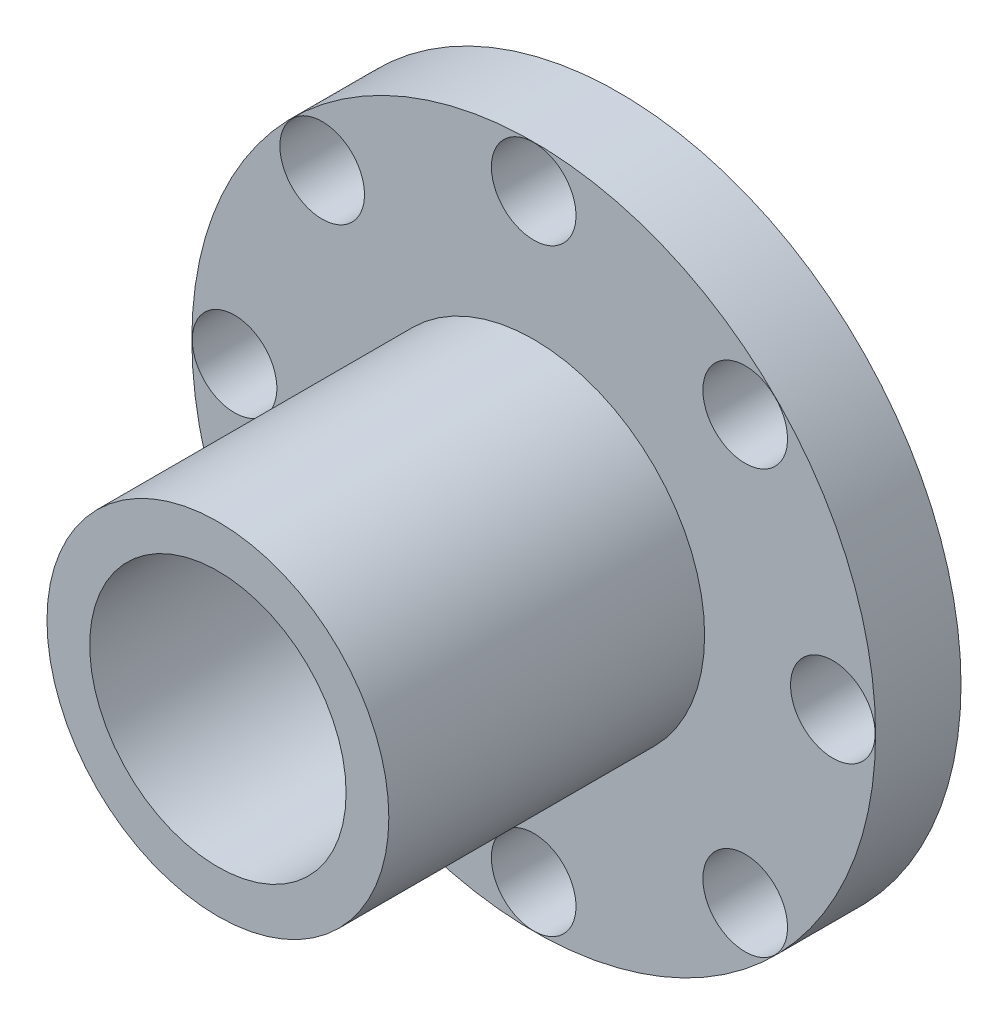
ISO-10303-21;
HEADER;
FILE_DESCRIPTION(('STEP AP214'),'2;1');
FILE_NAME('part.step','',(''),(''),'','','');
FILE_SCHEMA(('AUTOMOTIVE_DESIGN { 1 0 10303 214 1 1 1 1 }'));
ENDSEC;
DATA;
#1=APPLICATION_CONTEXT('core data for automotive mechanical design processes');
#2=APPLICATION_PROTOCOL_DEFINITION('international standard','automotive_design',2000,#1);
#3=PRODUCT_CONTEXT('',#1,'mechanical');
#4=PRODUCT('Part','Part','',(#3));
#5=PRODUCT_RELATED_PRODUCT_CATEGORY('part','',(#4));
#6=PRODUCT_DEFINITION_FORMATION('','',#4);
#7=PRODUCT_DEFINITION_CONTEXT('part definition',#1,'design');
#8=PRODUCT_DEFINITION('design','',#6,#7);
#9=PRODUCT_DEFINITION_SHAPE('','',#8);
#10=(LENGTH_UNIT() NAMED_UNIT(*) SI_UNIT(.MILLI.,.METRE.));
#11=(NAMED_UNIT(*) PLANE_ANGLE_UNIT() SI_UNIT($,.RADIAN.));
#12=(NAMED_UNIT(*) SI_UNIT($,.STERADIAN.) SOLID_ANGLE_UNIT());
#13=UNCERTAINTY_MEASURE_WITH_UNIT(LENGTH_MEASURE(1.E-05),#10,'distance_accuracy_value','');
#14=(GEOMETRIC_REPRESENTATION_CONTEXT(3) GLOBAL_UNCERTAINTY_ASSIGNED_CONTEXT((#13)) GLOBAL_UNIT_ASSIGNED_CONTEXT((#10,
#11,#12)) REPRESENTATION_CONTEXT('',''));
#15=CARTESIAN_POINT('',(0.,0.,0.));
#16=DIRECTION('',(0.,0.,1.));
#17=DIRECTION('',(1.,0.,0.));
#18=AXIS2_PLACEMENT_3D('',#15,#16,#17);
#19=CARTESIAN_POINT('',(0.,0.,9.39));
#20=DIRECTION('',(0.,0.,-1.));
#21=DIRECTION('',(-1.,0.,0.));
#22=AXIS2_PLACEMENT_3D('',#19,#20,#21);
#23=CYLINDRICAL_SURFACE('',#22,4.);
#24=CARTESIAN_POINT('',(0.,0.,9.39));
#25=DIRECTION('',(0.,0.,1.));
#26=DIRECTION('',(1.,0.,0.));
#27=AXIS2_PLACEMENT_3D('',#24,#25,#26);
#28=CIRCLE('',#27,4.);
#29=CARTESIAN_POINT('',(4.,0.,9.39));
#30=VERTEX_POINT('',#29);
#31=EDGE_CURVE('E43',#30,#30,#28,.T.);
#32=ORIENTED_EDGE('',*,*,#31,.F.);
#33=EDGE_LOOP('',(#32));
#34=FACE_BOUND('',#33,.T.);
#35=CARTESIAN_POINT('',(0.,0.,2.));
#36=DIRECTION('',(0.,0.,-1.));
#37=DIRECTION('',(-1.,0.,0.));
#38=AXIS2_PLACEMENT_3D('',#35,#36,#37);
#39=CIRCLE('',#38,4.);
#40=CARTESIAN_POINT('',(-4.,0.,2.));
#41=VERTEX_POINT('',#40);
#42=EDGE_CURVE('E11',#41,#41,#39,.T.);
#43=ORIENTED_EDGE('',*,*,#42,.F.);
#44=EDGE_LOOP('',(#43));
#45=FACE_BOUND('',#44,.T.);
#46=ADVANCED_FACE('F37',(#34,#45),#23,.T.);
#47=CARTESIAN_POINT('',(0.,0.,9.39));
#48=DIRECTION('',(0.,0.,1.));
#49=DIRECTION('',(1.,0.,0.));
#50=AXIS2_PLACEMENT_3D('',#47,#48,#49);
#51=PLANE('',#50);
#52=CARTESIAN_POINT('',(0.,0.,9.39));
#53=DIRECTION('',(0.,0.,1.));
#54=DIRECTION('',(1.,0.,0.));
#55=AXIS2_PLACEMENT_3D('',#52,#53,#54);
#56=CIRCLE('',#55,3.);
#57=CARTESIAN_POINT('',(3.,0.,9.39));
#58=VERTEX_POINT('',#57);
#59=EDGE_CURVE('E47',#58,#58,#56,.T.);
#60=ORIENTED_EDGE('',*,*,#59,.F.);
#61=EDGE_LOOP('',(#60));
#62=FACE_BOUND('',#61,.T.);
#63=ORIENTED_EDGE('',*,*,#31,.T.);
#64=EDGE_LOOP('',(#63));
#65=FACE_BOUND('',#64,.T.);
#66=ADVANCED_FACE('F125',(#62,#65),#51,.T.);
#67=CARTESIAN_POINT('',(0.,0.,0.));
#68=DIRECTION('',(0.,0.,1.));
#69=DIRECTION('',(1.,0.,0.));
#70=AXIS2_PLACEMENT_3D('',#67,#68,#69);
#71=PLANE('',#70);
#72=CARTESIAN_POINT('',(-7.,0.,0.));
#73=DIRECTION('',(0.,0.,-1.));
#74=DIRECTION('',(-1.,0.,0.));
#75=AXIS2_PLACEMENT_3D('',#72,#73,#74);
#76=CIRCLE('',#75,0.99);
#77=CARTESIAN_POINT('',(-7.99,0.,0.));
#78=VERTEX_POINT('',#77);
#79=EDGE_CURVE('E105',#78,#78,#76,.T.);
#80=ORIENTED_EDGE('',*,*,#79,.F.);
#81=EDGE_LOOP('',(#80));
#82=FACE_BOUND('',#81,.T.);
#83=CARTESIAN_POINT('',(-4.94974746830583,-4.94974746830584,0.));
#84=DIRECTION('',(0.,0.,-1.));
#85=DIRECTION('',(-1.,0.,0.));
#86=AXIS2_PLACEMENT_3D('',#83,#84,#85);
#87=CIRCLE('',#86,0.990000000000001);
#88=CARTESIAN_POINT('',(-5.93974746830583,-4.94974746830584,0.));
#89=VERTEX_POINT('',#88);
#90=EDGE_CURVE('E99',#89,#89,#87,.T.);
#91=ORIENTED_EDGE('',*,*,#90,.F.);
#92=EDGE_LOOP('',(#91));
#93=FACE_BOUND('',#92,.T.);
#94=CARTESIAN_POINT('',(0.,-7.,0.));
#95=DIRECTION('',(0.,0.,-1.));
#96=DIRECTION('',(-1.,0.,0.));
#97=AXIS2_PLACEMENT_3D('',#94,#95,#96);
#98=CIRCLE('',#97,0.990000000000001);
#99=CARTESIAN_POINT('',(-0.989999999999977,-7.,0.));
#100=VERTEX_POINT('',#99);
#101=EDGE_CURVE('E93',#100,#100,#98,.T.);
#102=ORIENTED_EDGE('',*,*,#101,.F.);
#103=EDGE_LOOP('',(#102));
#104=FACE_BOUND('',#103,.T.);
#105=CARTESIAN_POINT('',(4.94974746830586,-4.94974746830581,0.));
#106=DIRECTION('',(0.,0.,-1.));
#107=DIRECTION('',(-1.,0.,0.));
#108=AXIS2_PLACEMENT_3D('',#105,#106,#107);
#109=CIRCLE('',#108,0.990000000000001);
#110=CARTESIAN_POINT('',(3.95974746830586,-4.94974746830581,0.));
#111=VERTEX_POINT('',#110);
#112=EDGE_CURVE('E87',#111,#111,#109,.T.);
#113=ORIENTED_EDGE('',*,*,#112,.F.);
#114=EDGE_LOOP('',(#113));
#115=FACE_BOUND('',#114,.T.);
#116=CARTESIAN_POINT('',(7.,0.,0.));
#117=DIRECTION('',(0.,0.,-1.));
#118=DIRECTION('',(-1.,0.,0.));
#119=AXIS2_PLACEMENT_3D('',#116,#117,#118);
#120=CIRCLE('',#119,0.99);
#121=CARTESIAN_POINT('',(6.01,0.,0.));
#122=VERTEX_POINT('',#121);
#123=EDGE_CURVE('E81',#122,#122,#120,.T.);
#124=ORIENTED_EDGE('',*,*,#123,.F.);
#125=EDGE_LOOP('',(#124));
#126=FACE_BOUND('',#125,.T.);
#127=CARTESIAN_POINT('',(4.94974746830579,4.94974746830588,0.));
#128=DIRECTION('',(0.,0.,-1.));
#129=DIRECTION('',(-1.,0.,0.));
#130=AXIS2_PLACEMENT_3D('',#127,#128,#129);
#131=CIRCLE('',#130,0.99);
#132=CARTESIAN_POINT('',(3.95974746830579,4.94974746830588,0.));
#133=VERTEX_POINT('',#132);
#134=EDGE_CURVE('E75',#133,#133,#131,.T.);
#135=ORIENTED_EDGE('',*,*,#134,.F.);
#136=EDGE_LOOP('',(#135));
#137=FACE_BOUND('',#136,.T.);
#138=CARTESIAN_POINT('',(0.,7.,0.));
#139=DIRECTION('',(0.,0.,-1.));
#140=DIRECTION('',(-1.,0.,0.));
#141=AXIS2_PLACEMENT_3D('',#138,#139,#140);
#142=CIRCLE('',#141,0.99);
#143=CARTESIAN_POINT('',(-0.990000000000073,7.,0.));
#144=VERTEX_POINT('',#143);
#145=EDGE_CURVE('E69',#144,#144,#142,.T.);
#146=ORIENTED_EDGE('',*,*,#145,.F.);
#147=EDGE_LOOP('',(#146));
#148=FACE_BOUND('',#147,.T.);
#149=CARTESIAN_POINT('',(-4.94974746830589,4.94974746830577,0.));
#150=DIRECTION('',(0.,0.,-1.));
#151=DIRECTION('',(-1.,0.,0.));
#152=AXIS2_PLACEMENT_3D('',#149,#150,#151);
#153=CIRCLE('',#152,0.99);
#154=CARTESIAN_POINT('',(-5.93974746830589,4.94974746830577,0.));
#155=VERTEX_POINT('',#154);
#156=EDGE_CURVE('E63',#155,#155,#153,.T.);
#157=ORIENTED_EDGE('',*,*,#156,.F.);
#158=EDGE_LOOP('',(#157));
#159=FACE_BOUND('',#158,.T.);
#160=CARTESIAN_POINT('',(0.,0.,0.));
#161=DIRECTION('',(0.,0.,-1.));
#162=DIRECTION('',(-1.,0.,0.));
#163=AXIS2_PLACEMENT_3D('',#160,#161,#162);
#164=CIRCLE('',#163,3.);
#165=CARTESIAN_POINT('',(-3.,0.,0.));
#166=VERTEX_POINT('',#165);
#167=EDGE_CURVE('E51',#166,#166,#164,.T.);
#168=ORIENTED_EDGE('',*,*,#167,.F.);
#169=EDGE_LOOP('',(#168));
#170=FACE_BOUND('',#169,.T.);
#171=CARTESIAN_POINT('',(0.,0.,0.));
#172=DIRECTION('',(0.,0.,-1.));
#173=DIRECTION('',(-1.,0.,0.));
#174=AXIS2_PLACEMENT_3D('',#171,#172,#173);
#175=CIRCLE('',#174,8.);
#176=CARTESIAN_POINT('',(-8.,0.,0.));
#177=VERTEX_POINT('',#176);
#178=EDGE_CURVE('E57',#177,#177,#175,.T.);
#179=ORIENTED_EDGE('',*,*,#178,.T.);
#180=EDGE_LOOP('',(#179));
#181=FACE_BOUND('',#180,.T.);
#182=ADVANCED_FACE('F121',(#82,#93,#104,#115,#126,#137,#148,#159,#170,#181),#71,.F.);
#183=CARTESIAN_POINT('',(0.,0.,1.39));
#184=DIRECTION('',(0.,0.,1.));
#185=DIRECTION('',(1.,0.,0.));
#186=AXIS2_PLACEMENT_3D('',#183,#184,#185);
#187=CYLINDRICAL_SURFACE('',#186,3.);
#188=ORIENTED_EDGE('',*,*,#167,.T.);
#189=EDGE_LOOP('',(#188));
#190=FACE_BOUND('',#189,.T.);
#191=ORIENTED_EDGE('',*,*,#59,.T.);
#192=EDGE_LOOP('',(#191));
#193=FACE_BOUND('',#192,.T.);
#194=ADVANCED_FACE('F124',(#190,#193),#187,.F.);
#195=CARTESIAN_POINT('',(0.,0.,2.));
#196=DIRECTION('',(0.,0.,-1.));
#197=DIRECTION('',(-1.,0.,0.));
#198=AXIS2_PLACEMENT_3D('',#195,#196,#197);
#199=CYLINDRICAL_SURFACE('',#198,8.);
#200=CARTESIAN_POINT('',(0.,0.,2.));
#201=DIRECTION('',(0.,0.,-1.));
#202=DIRECTION('',(-1.,0.,0.));
#203=AXIS2_PLACEMENT_3D('',#200,#201,#202);
#204=CIRCLE('',#203,8.);
#205=CARTESIAN_POINT('',(-8.,0.,2.));
#206=VERTEX_POINT('',#205);
#207=EDGE_CURVE('E56',#206,#206,#204,.T.);
#208=ORIENTED_EDGE('',*,*,#207,.T.);
#209=EDGE_LOOP('',(#208));
#210=FACE_BOUND('',#209,.T.);
#211=ORIENTED_EDGE('',*,*,#178,.F.);
#212=EDGE_LOOP('',(#211));
#213=FACE_BOUND('',#212,.T.);
#214=ADVANCED_FACE('F144',(#210,#213),#199,.T.);
#215=CARTESIAN_POINT('',(0.,0.,2.));
#216=DIRECTION('',(0.,0.,-1.));
#217=DIRECTION('',(-1.,0.,0.));
#218=AXIS2_PLACEMENT_3D('',#215,#216,#217);
#219=PLANE('',#218);
#220=CARTESIAN_POINT('',(-7.,0.,2.));
#221=DIRECTION('',(0.,0.,-1.));
#222=DIRECTION('',(-1.,0.,0.));
#223=AXIS2_PLACEMENT_3D('',#220,#221,#222);
#224=CIRCLE('',#223,0.99);
#225=CARTESIAN_POINT('',(-7.99,0.,2.));
#226=VERTEX_POINT('',#225);
#227=EDGE_CURVE('E60',#226,#226,#224,.T.);
#228=ORIENTED_EDGE('',*,*,#227,.T.);
#229=EDGE_LOOP('',(#228));
#230=FACE_BOUND('',#229,.T.);
#231=CARTESIAN_POINT('',(-4.94974746830583,-4.94974746830584,2.));
#232=DIRECTION('',(0.,0.,-1.));
#233=DIRECTION('',(-1.,0.,0.));
#234=AXIS2_PLACEMENT_3D('',#231,#232,#233);
#235=CIRCLE('',#234,0.990000000000001);
#236=CARTESIAN_POINT('',(-5.93974746830583,-4.94974746830584,2.));
#237=VERTEX_POINT('',#236);
#238=EDGE_CURVE('E102',#237,#237,#235,.T.);
#239=ORIENTED_EDGE('',*,*,#238,.T.);
#240=EDGE_LOOP('',(#239));
#241=FACE_BOUND('',#240,.T.);
#242=CARTESIAN_POINT('',(0.,-7.,2.));
#243=DIRECTION('',(0.,0.,-1.));
#244=DIRECTION('',(-1.,0.,0.));
#245=AXIS2_PLACEMENT_3D('',#242,#243,#244);
#246=CIRCLE('',#245,0.990000000000001);
#247=CARTESIAN_POINT('',(-0.989999999999977,-7.,2.));
#248=VERTEX_POINT('',#247);
#249=EDGE_CURVE('E96',#248,#248,#246,.T.);
#250=ORIENTED_EDGE('',*,*,#249,.T.);
#251=EDGE_LOOP('',(#250));
#252=FACE_BOUND('',#251,.T.);
#253=CARTESIAN_POINT('',(4.94974746830586,-4.94974746830581,2.));
#254=DIRECTION('',(0.,0.,-1.));
#255=DIRECTION('',(-1.,0.,0.));
#256=AXIS2_PLACEMENT_3D('',#253,#254,#255);
#257=CIRCLE('',#256,0.990000000000001);
#258=CARTESIAN_POINT('',(3.95974746830586,-4.94974746830581,2.));
#259=VERTEX_POINT('',#258);
#260=EDGE_CURVE('E90',#259,#259,#257,.T.);
#261=ORIENTED_EDGE('',*,*,#260,.T.);
#262=EDGE_LOOP('',(#261));
#263=FACE_BOUND('',#262,.T.);
#264=CARTESIAN_POINT('',(7.,0.,2.));
#265=DIRECTION('',(0.,0.,-1.));
#266=DIRECTION('',(-1.,0.,0.));
#267=AXIS2_PLACEMENT_3D('',#264,#265,#266);
#268=CIRCLE('',#267,0.99);
#269=CARTESIAN_POINT('',(6.01,0.,2.));
#270=VERTEX_POINT('',#269);
#271=EDGE_CURVE('E84',#270,#270,#268,.T.);
#272=ORIENTED_EDGE('',*,*,#271,.T.);
#273=EDGE_LOOP('',(#272));
#274=FACE_BOUND('',#273,.T.);
#275=CARTESIAN_POINT('',(4.94974746830579,4.94974746830588,2.));
#276=DIRECTION('',(0.,0.,-1.));
#277=DIRECTION('',(-1.,0.,0.));
#278=AXIS2_PLACEMENT_3D('',#275,#276,#277);
#279=CIRCLE('',#278,0.99);
#280=CARTESIAN_POINT('',(3.95974746830579,4.94974746830588,2.));
#281=VERTEX_POINT('',#280);
#282=EDGE_CURVE('E78',#281,#281,#279,.T.);
#283=ORIENTED_EDGE('',*,*,#282,.T.);
#284=EDGE_LOOP('',(#283));
#285=FACE_BOUND('',#284,.T.);
#286=CARTESIAN_POINT('',(0.,7.,2.));
#287=DIRECTION('',(0.,0.,-1.));
#288=DIRECTION('',(-1.,0.,0.));
#289=AXIS2_PLACEMENT_3D('',#286,#287,#288);
#290=CIRCLE('',#289,0.99);
#291=CARTESIAN_POINT('',(-0.990000000000073,7.,2.));
#292=VERTEX_POINT('',#291);
#293=EDGE_CURVE('E72',#292,#292,#290,.T.);
#294=ORIENTED_EDGE('',*,*,#293,.T.);
#295=EDGE_LOOP('',(#294));
#296=FACE_BOUND('',#295,.T.);
#297=CARTESIAN_POINT('',(-4.94974746830589,4.94974746830577,2.));
#298=DIRECTION('',(0.,0.,-1.));
#299=DIRECTION('',(-1.,0.,0.));
#300=AXIS2_PLACEMENT_3D('',#297,#298,#299);
#301=CIRCLE('',#300,0.99);
#302=CARTESIAN_POINT('',(-5.93974746830589,4.94974746830577,2.));
#303=VERTEX_POINT('',#302);
#304=EDGE_CURVE('E66',#303,#303,#301,.T.);
#305=ORIENTED_EDGE('',*,*,#304,.T.);
#306=EDGE_LOOP('',(#305));
#307=FACE_BOUND('',#306,.T.);
#308=ORIENTED_EDGE('',*,*,#42,.T.);
#309=EDGE_LOOP('',(#308));
#310=FACE_BOUND('',#309,.T.);
#311=ORIENTED_EDGE('',*,*,#207,.F.);
#312=EDGE_LOOP('',(#311));
#313=FACE_BOUND('',#312,.T.);
#314=ADVANCED_FACE('F111',(#230,#241,#252,#263,#274,#285,#296,#307,#310,#313),#219,.F.);
#315=CARTESIAN_POINT('',(-4.94974746830589,4.94974746830577,2.));
#316=DIRECTION('',(0.,0.,-1.));
#317=DIRECTION('',(-1.,0.,0.));
#318=AXIS2_PLACEMENT_3D('',#315,#316,#317);
#319=CYLINDRICAL_SURFACE('',#318,0.99);
#320=ORIENTED_EDGE('',*,*,#304,.F.);
#321=EDGE_LOOP('',(#320));
#322=FACE_BOUND('',#321,.T.);
#323=ORIENTED_EDGE('',*,*,#156,.T.);
#324=EDGE_LOOP('',(#323));
#325=FACE_BOUND('',#324,.T.);
#326=ADVANCED_FACE('F152',(#322,#325),#319,.F.);
#327=CARTESIAN_POINT('',(0.,7.,2.));
#328=DIRECTION('',(0.,0.,-1.));
#329=DIRECTION('',(-1.,0.,0.));
#330=AXIS2_PLACEMENT_3D('',#327,#328,#329);
#331=CYLINDRICAL_SURFACE('',#330,0.99);
#332=ORIENTED_EDGE('',*,*,#293,.F.);
#333=EDGE_LOOP('',(#332));
#334=FACE_BOUND('',#333,.T.);
#335=ORIENTED_EDGE('',*,*,#145,.T.);
#336=EDGE_LOOP('',(#335));
#337=FACE_BOUND('',#336,.T.);
#338=ADVANCED_FACE('F203',(#334,#337),#331,.F.);
#339=CARTESIAN_POINT('',(4.94974746830579,4.94974746830588,2.));
#340=DIRECTION('',(0.,0.,-1.));
#341=DIRECTION('',(-1.,0.,0.));
#342=AXIS2_PLACEMENT_3D('',#339,#340,#341);
#343=CYLINDRICAL_SURFACE('',#342,0.99);
#344=ORIENTED_EDGE('',*,*,#282,.F.);
#345=EDGE_LOOP('',(#344));
#346=FACE_BOUND('',#345,.T.);
#347=ORIENTED_EDGE('',*,*,#134,.T.);
#348=EDGE_LOOP('',(#347));
#349=FACE_BOUND('',#348,.T.);
#350=ADVANCED_FACE('F212',(#346,#349),#343,.F.);
#351=CARTESIAN_POINT('',(7.,0.,2.));
#352=DIRECTION('',(0.,0.,-1.));
#353=DIRECTION('',(-1.,0.,0.));
#354=AXIS2_PLACEMENT_3D('',#351,#352,#353);
#355=CYLINDRICAL_SURFACE('',#354,0.99);
#356=ORIENTED_EDGE('',*,*,#271,.F.);
#357=EDGE_LOOP('',(#356));
#358=FACE_BOUND('',#357,.T.);
#359=ORIENTED_EDGE('',*,*,#123,.T.);
#360=EDGE_LOOP('',(#359));
#361=FACE_BOUND('',#360,.T.);
#362=ADVANCED_FACE('F221',(#358,#361),#355,.F.);
#363=CARTESIAN_POINT('',(4.94974746830586,-4.94974746830581,2.));
#364=DIRECTION('',(0.,0.,-1.));
#365=DIRECTION('',(-1.,0.,0.));
#366=AXIS2_PLACEMENT_3D('',#363,#364,#365);
#367=CYLINDRICAL_SURFACE('',#366,0.990000000000001);
#368=ORIENTED_EDGE('',*,*,#260,.F.);
#369=EDGE_LOOP('',(#368));
#370=FACE_BOUND('',#369,.T.);
#371=ORIENTED_EDGE('',*,*,#112,.T.);
#372=EDGE_LOOP('',(#371));
#373=FACE_BOUND('',#372,.T.);
#374=ADVANCED_FACE('F230',(#370,#373),#367,.F.);
#375=CARTESIAN_POINT('',(0.,-7.,2.));
#376=DIRECTION('',(0.,0.,-1.));
#377=DIRECTION('',(-1.,0.,0.));
#378=AXIS2_PLACEMENT_3D('',#375,#376,#377);
#379=CYLINDRICAL_SURFACE('',#378,0.990000000000001);
#380=ORIENTED_EDGE('',*,*,#249,.F.);
#381=EDGE_LOOP('',(#380));
#382=FACE_BOUND('',#381,.T.);
#383=ORIENTED_EDGE('',*,*,#101,.T.);
#384=EDGE_LOOP('',(#383));
#385=FACE_BOUND('',#384,.T.);
#386=ADVANCED_FACE('F239',(#382,#385),#379,.F.);
#387=CARTESIAN_POINT('',(-4.94974746830583,-4.94974746830584,2.));
#388=DIRECTION('',(0.,0.,-1.));
#389=DIRECTION('',(-1.,0.,0.));
#390=AXIS2_PLACEMENT_3D('',#387,#388,#389);
#391=CYLINDRICAL_SURFACE('',#390,0.990000000000001);
#392=ORIENTED_EDGE('',*,*,#238,.F.);
#393=EDGE_LOOP('',(#392));
#394=FACE_BOUND('',#393,.T.);
#395=ORIENTED_EDGE('',*,*,#90,.T.);
#396=EDGE_LOOP('',(#395));
#397=FACE_BOUND('',#396,.T.);
#398=ADVANCED_FACE('F117',(#394,#397),#391,.F.);
#399=CARTESIAN_POINT('',(-7.,0.,2.));
#400=DIRECTION('',(0.,0.,-1.));
#401=DIRECTION('',(-1.,0.,0.));
#402=AXIS2_PLACEMENT_3D('',#399,#400,#401);
#403=CYLINDRICAL_SURFACE('',#402,0.99);
#404=ORIENTED_EDGE('',*,*,#227,.F.);
#405=EDGE_LOOP('',(#404));
#406=FACE_BOUND('',#405,.T.);
#407=ORIENTED_EDGE('',*,*,#79,.T.);
#408=EDGE_LOOP('',(#407));
#409=FACE_BOUND('',#408,.T.);
#410=ADVANCED_FACE('F114',(#406,#409),#403,.F.);
#411=CLOSED_SHELL('',(#46,#66,#182,#194,#214,#314,#326,#338,#350,#362,#374,#386,#398,#410));
#412=MANIFOLD_SOLID_BREP('B2',#411);
#413=ADVANCED_BREP_SHAPE_REPRESENTATION('',(#18,#412),#14);
#414=SHAPE_DEFINITION_REPRESENTATION(#9,#413);
ENDSEC;
END-ISO-10303-21;
